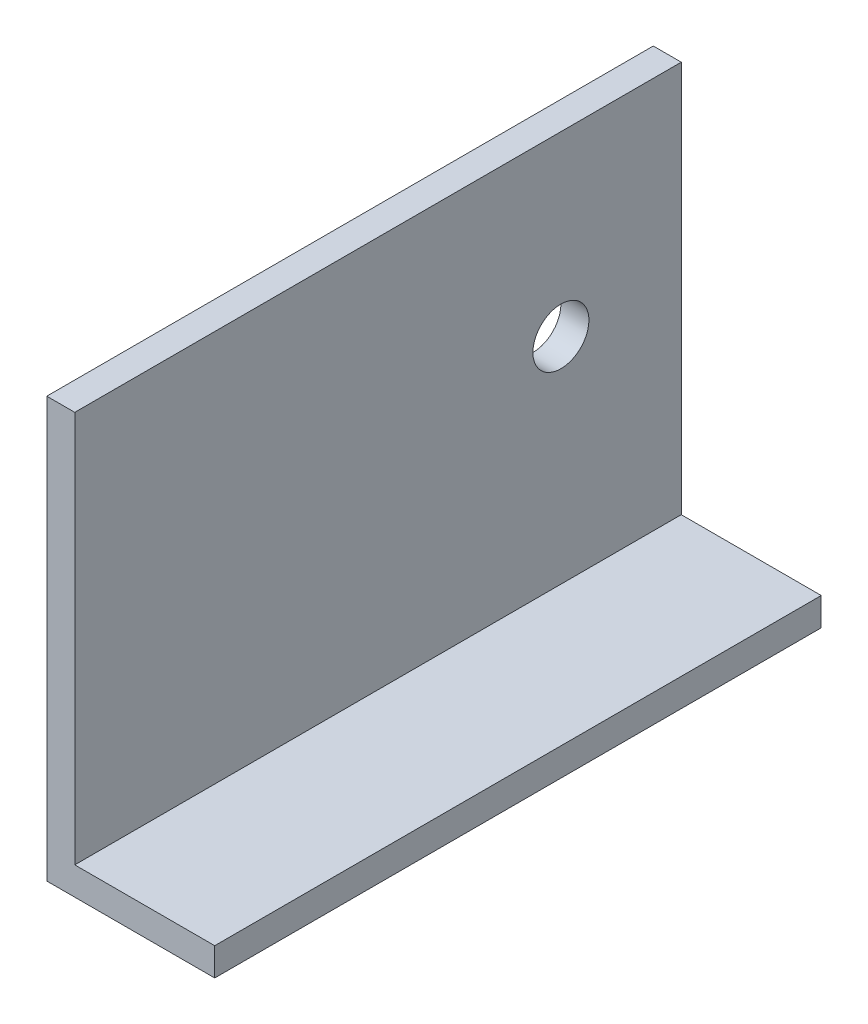
ISO-10303-21;
HEADER;
FILE_DESCRIPTION(('STEP AP214'),'2;1');
FILE_NAME('part.step','',(''),(''),'','','');
FILE_SCHEMA(('AUTOMOTIVE_DESIGN { 1 0 10303 214 1 1 1 1 }'));
ENDSEC;
DATA;
#1=APPLICATION_CONTEXT('core data for automotive mechanical design processes');
#2=APPLICATION_PROTOCOL_DEFINITION('international standard','automotive_design',2000,#1);
#3=PRODUCT_CONTEXT('',#1,'mechanical');
#4=PRODUCT('Part','Part','',(#3));
#5=PRODUCT_RELATED_PRODUCT_CATEGORY('part','',(#4));
#6=PRODUCT_DEFINITION_FORMATION('','',#4);
#7=PRODUCT_DEFINITION_CONTEXT('part definition',#1,'design');
#8=PRODUCT_DEFINITION('design','',#6,#7);
#9=PRODUCT_DEFINITION_SHAPE('','',#8);
#10=(LENGTH_UNIT() NAMED_UNIT(*) SI_UNIT(.MILLI.,.METRE.));
#11=(NAMED_UNIT(*) PLANE_ANGLE_UNIT() SI_UNIT($,.RADIAN.));
#12=(NAMED_UNIT(*) SI_UNIT($,.STERADIAN.) SOLID_ANGLE_UNIT());
#13=UNCERTAINTY_MEASURE_WITH_UNIT(LENGTH_MEASURE(1.E-05),#10,'distance_accuracy_value','');
#14=(GEOMETRIC_REPRESENTATION_CONTEXT(3) GLOBAL_UNCERTAINTY_ASSIGNED_CONTEXT((#13)) GLOBAL_UNIT_ASSIGNED_CONTEXT((#10,
#11,#12)) REPRESENTATION_CONTEXT('',''));
#15=CARTESIAN_POINT('',(0.,0.,0.));
#16=DIRECTION('',(0.,0.,1.));
#17=DIRECTION('',(1.,0.,0.));
#18=AXIS2_PLACEMENT_3D('',#15,#16,#17);
#19=CARTESIAN_POINT('',(0.,45.,65.));
#20=DIRECTION('',(1.,0.,0.));
#21=DIRECTION('',(0.,1.,0.));
#22=AXIS2_PLACEMENT_3D('',#19,#20,#21);
#23=PLANE('',#22);
#24=CARTESIAN_POINT('',(0.,26.,12.9));
#25=DIRECTION('',(1.,0.,0.));
#26=DIRECTION('',(0.,1.,0.));
#27=AXIS2_PLACEMENT_3D('',#24,#25,#26);
#28=CIRCLE('',#27,3.);
#29=CARTESIAN_POINT('',(0.,29.,12.9));
#30=VERTEX_POINT('',#29);
#31=EDGE_CURVE('E110',#30,#30,#28,.T.);
#32=ORIENTED_EDGE('',*,*,#31,.T.);
#33=EDGE_LOOP('',(#32));
#34=FACE_BOUND('',#33,.T.);
#35=DIRECTION('',(0.,-1.,0.));
#36=VECTOR('',#35,1.);
#37=CARTESIAN_POINT('',(0.,45.,0.));
#38=LINE('',#37,#36);
#39=CARTESIAN_POINT('',(0.,45.,0.));
#40=VERTEX_POINT('',#39);
#41=CARTESIAN_POINT('',(0.,0.,0.));
#42=VERTEX_POINT('',#41);
#43=EDGE_CURVE('E129',#40,#42,#38,.T.);
#44=ORIENTED_EDGE('',*,*,#43,.T.);
#45=DIRECTION('',(0.,0.,-1.));
#46=VECTOR('',#45,1.);
#47=CARTESIAN_POINT('',(0.,0.,65.));
#48=LINE('',#47,#46);
#49=CARTESIAN_POINT('',(0.,0.,65.));
#50=VERTEX_POINT('',#49);
#51=EDGE_CURVE('E126',#50,#42,#48,.T.);
#52=ORIENTED_EDGE('',*,*,#51,.F.);
#53=DIRECTION('',(0.,-1.,0.));
#54=VECTOR('',#53,1.);
#55=CARTESIAN_POINT('',(0.,45.,65.));
#56=LINE('',#55,#54);
#57=CARTESIAN_POINT('',(0.,45.,65.));
#58=VERTEX_POINT('',#57);
#59=EDGE_CURVE('E128',#58,#50,#56,.T.);
#60=ORIENTED_EDGE('',*,*,#59,.F.);
#61=DIRECTION('',(0.,0.,-1.));
#62=VECTOR('',#61,1.);
#63=CARTESIAN_POINT('',(0.,45.,65.));
#64=LINE('',#63,#62);
#65=EDGE_CURVE('E123',#58,#40,#64,.T.);
#66=ORIENTED_EDGE('',*,*,#65,.T.);
#67=EDGE_LOOP('',(#44,#52,#60,#66));
#68=FACE_BOUND('',#67,.T.);
#69=ADVANCED_FACE('F59',(#34,#68),#23,.F.);
#70=CARTESIAN_POINT('',(0.,45.,65.));
#71=DIRECTION('',(0.,1.,0.));
#72=DIRECTION('',(0.,0.,1.));
#73=AXIS2_PLACEMENT_3D('',#70,#71,#72);
#74=PLANE('',#73);
#75=DIRECTION('',(1.,0.,0.));
#76=VECTOR('',#75,1.);
#77=CARTESIAN_POINT('',(0.,45.,0.));
#78=LINE('',#77,#76);
#79=CARTESIAN_POINT('',(3.,45.,0.));
#80=VERTEX_POINT('',#79);
#81=EDGE_CURVE('E133',#40,#80,#78,.T.);
#82=ORIENTED_EDGE('',*,*,#81,.F.);
#83=ORIENTED_EDGE('',*,*,#65,.F.);
#84=DIRECTION('',(1.,0.,0.));
#85=VECTOR('',#84,1.);
#86=CARTESIAN_POINT('',(0.,45.,65.));
#87=LINE('',#86,#85);
#88=CARTESIAN_POINT('',(3.,45.,65.));
#89=VERTEX_POINT('',#88);
#90=EDGE_CURVE('E139',#58,#89,#87,.T.);
#91=ORIENTED_EDGE('',*,*,#90,.T.);
#92=DIRECTION('',(0.,0.,-1.));
#93=VECTOR('',#92,1.);
#94=CARTESIAN_POINT('',(3.,45.,65.));
#95=LINE('',#94,#93);
#96=EDGE_CURVE('E69',#89,#80,#95,.T.);
#97=ORIENTED_EDGE('',*,*,#96,.T.);
#98=EDGE_LOOP('',(#82,#83,#91,#97));
#99=FACE_BOUND('',#98,.T.);
#100=ADVANCED_FACE('F172',(#99),#74,.T.);
#101=CARTESIAN_POINT('',(0.,0.,0.));
#102=DIRECTION('',(0.,0.,-1.));
#103=DIRECTION('',(-1.,0.,0.));
#104=AXIS2_PLACEMENT_3D('',#101,#102,#103);
#105=PLANE('',#104);
#106=DIRECTION('',(1.,0.,0.));
#107=VECTOR('',#106,1.);
#108=CARTESIAN_POINT('',(0.,0.,0.));
#109=LINE('',#108,#107);
#110=CARTESIAN_POINT('',(18.,0.,0.));
#111=VERTEX_POINT('',#110);
#112=EDGE_CURVE('E94',#42,#111,#109,.T.);
#113=ORIENTED_EDGE('',*,*,#112,.F.);
#114=ORIENTED_EDGE('',*,*,#43,.F.);
#115=ORIENTED_EDGE('',*,*,#81,.T.);
#116=DIRECTION('',(0.,-1.,0.));
#117=VECTOR('',#116,1.);
#118=CARTESIAN_POINT('',(3.,45.,0.));
#119=LINE('',#118,#117);
#120=CARTESIAN_POINT('',(3.,3.00000000000002,0.));
#121=VERTEX_POINT('',#120);
#122=EDGE_CURVE('E115',#80,#121,#119,.T.);
#123=ORIENTED_EDGE('',*,*,#122,.T.);
#124=DIRECTION('',(1.,0.,0.));
#125=VECTOR('',#124,1.);
#126=CARTESIAN_POINT('',(3.,3.,0.));
#127=LINE('',#126,#125);
#128=CARTESIAN_POINT('',(18.,3.,0.));
#129=VERTEX_POINT('',#128);
#130=EDGE_CURVE('E101',#121,#129,#127,.T.);
#131=ORIENTED_EDGE('',*,*,#130,.T.);
#132=DIRECTION('',(0.,-1.,0.));
#133=VECTOR('',#132,1.);
#134=CARTESIAN_POINT('',(18.,3.,0.));
#135=LINE('',#134,#133);
#136=EDGE_CURVE('E108',#129,#111,#135,.T.);
#137=ORIENTED_EDGE('',*,*,#136,.T.);
#138=EDGE_LOOP('',(#113,#114,#115,#123,#131,#137));
#139=FACE_BOUND('',#138,.T.);
#140=ADVANCED_FACE('F112',(#139),#105,.T.);
#141=CARTESIAN_POINT('',(0.,0.,65.));
#142=DIRECTION('',(0.,0.,-1.));
#143=DIRECTION('',(-1.,0.,0.));
#144=AXIS2_PLACEMENT_3D('',#141,#142,#143);
#145=PLANE('',#144);
#146=DIRECTION('',(1.,0.,0.));
#147=VECTOR('',#146,1.);
#148=CARTESIAN_POINT('',(0.,0.,65.));
#149=LINE('',#148,#147);
#150=CARTESIAN_POINT('',(18.,0.,65.));
#151=VERTEX_POINT('',#150);
#152=EDGE_CURVE('E132',#50,#151,#149,.T.);
#153=ORIENTED_EDGE('',*,*,#152,.T.);
#154=DIRECTION('',(0.,-1.,0.));
#155=VECTOR('',#154,1.);
#156=CARTESIAN_POINT('',(18.,3.,65.));
#157=LINE('',#156,#155);
#158=CARTESIAN_POINT('',(18.,3.,65.));
#159=VERTEX_POINT('',#158);
#160=EDGE_CURVE('E116',#159,#151,#157,.T.);
#161=ORIENTED_EDGE('',*,*,#160,.F.);
#162=DIRECTION('',(1.,0.,0.));
#163=VECTOR('',#162,1.);
#164=CARTESIAN_POINT('',(3.,3.,65.));
#165=LINE('',#164,#163);
#166=CARTESIAN_POINT('',(3.,3.00000000000002,65.));
#167=VERTEX_POINT('',#166);
#168=EDGE_CURVE('E103',#167,#159,#165,.T.);
#169=ORIENTED_EDGE('',*,*,#168,.F.);
#170=DIRECTION('',(0.,-1.,0.));
#171=VECTOR('',#170,1.);
#172=CARTESIAN_POINT('',(3.,45.,65.));
#173=LINE('',#172,#171);
#174=EDGE_CURVE('E142',#89,#167,#173,.T.);
#175=ORIENTED_EDGE('',*,*,#174,.F.);
#176=ORIENTED_EDGE('',*,*,#90,.F.);
#177=ORIENTED_EDGE('',*,*,#59,.T.);
#178=EDGE_LOOP('',(#153,#161,#169,#175,#176,#177));
#179=FACE_BOUND('',#178,.T.);
#180=ADVANCED_FACE('F159',(#179),#145,.F.);
#181=CARTESIAN_POINT('',(3.,45.,65.));
#182=DIRECTION('',(1.,0.,0.));
#183=DIRECTION('',(0.,1.,0.));
#184=AXIS2_PLACEMENT_3D('',#181,#182,#183);
#185=PLANE('',#184);
#186=CARTESIAN_POINT('',(3.,26.,12.9));
#187=DIRECTION('',(1.,0.,0.));
#188=DIRECTION('',(0.,1.,0.));
#189=AXIS2_PLACEMENT_3D('',#186,#187,#188);
#190=CIRCLE('',#189,3.);
#191=CARTESIAN_POINT('',(3.,29.,12.9));
#192=VERTEX_POINT('',#191);
#193=EDGE_CURVE('E148',#192,#192,#190,.T.);
#194=ORIENTED_EDGE('',*,*,#193,.F.);
#195=EDGE_LOOP('',(#194));
#196=FACE_BOUND('',#195,.T.);
#197=ORIENTED_EDGE('',*,*,#174,.T.);
#198=DIRECTION('',(0.,0.,-1.));
#199=VECTOR('',#198,1.);
#200=CARTESIAN_POINT('',(3.,3.,65.));
#201=LINE('',#200,#199);
#202=EDGE_CURVE('E12',#167,#121,#201,.T.);
#203=ORIENTED_EDGE('',*,*,#202,.T.);
#204=ORIENTED_EDGE('',*,*,#122,.F.);
#205=ORIENTED_EDGE('',*,*,#96,.F.);
#206=EDGE_LOOP('',(#197,#203,#204,#205));
#207=FACE_BOUND('',#206,.T.);
#208=ADVANCED_FACE('F155',(#196,#207),#185,.T.);
#209=CARTESIAN_POINT('',(0.,0.,65.));
#210=DIRECTION('',(0.,1.,0.));
#211=DIRECTION('',(0.,0.,1.));
#212=AXIS2_PLACEMENT_3D('',#209,#210,#211);
#213=PLANE('',#212);
#214=ORIENTED_EDGE('',*,*,#112,.T.);
#215=DIRECTION('',(0.,0.,-1.));
#216=VECTOR('',#215,1.);
#217=CARTESIAN_POINT('',(18.,0.,65.));
#218=LINE('',#217,#216);
#219=EDGE_CURVE('E63',#151,#111,#218,.T.);
#220=ORIENTED_EDGE('',*,*,#219,.F.);
#221=ORIENTED_EDGE('',*,*,#152,.F.);
#222=ORIENTED_EDGE('',*,*,#51,.T.);
#223=EDGE_LOOP('',(#214,#220,#221,#222));
#224=FACE_BOUND('',#223,.T.);
#225=ADVANCED_FACE('F158',(#224),#213,.F.);
#226=CARTESIAN_POINT('',(18.,3.,65.));
#227=DIRECTION('',(1.,0.,0.));
#228=DIRECTION('',(0.,1.,0.));
#229=AXIS2_PLACEMENT_3D('',#226,#227,#228);
#230=PLANE('',#229);
#231=ORIENTED_EDGE('',*,*,#136,.F.);
#232=DIRECTION('',(0.,0.,-1.));
#233=VECTOR('',#232,1.);
#234=CARTESIAN_POINT('',(18.,3.,65.));
#235=LINE('',#234,#233);
#236=EDGE_CURVE('E97',#159,#129,#235,.T.);
#237=ORIENTED_EDGE('',*,*,#236,.F.);
#238=ORIENTED_EDGE('',*,*,#160,.T.);
#239=ORIENTED_EDGE('',*,*,#219,.T.);
#240=EDGE_LOOP('',(#231,#237,#238,#239));
#241=FACE_BOUND('',#240,.T.);
#242=ADVANCED_FACE('F61',(#241),#230,.T.);
#243=CARTESIAN_POINT('',(3.,3.,65.));
#244=DIRECTION('',(0.,1.,0.));
#245=DIRECTION('',(0.,0.,1.));
#246=AXIS2_PLACEMENT_3D('',#243,#244,#245);
#247=PLANE('',#246);
#248=ORIENTED_EDGE('',*,*,#130,.F.);
#249=ORIENTED_EDGE('',*,*,#202,.F.);
#250=ORIENTED_EDGE('',*,*,#168,.T.);
#251=ORIENTED_EDGE('',*,*,#236,.T.);
#252=EDGE_LOOP('',(#248,#249,#250,#251));
#253=FACE_BOUND('',#252,.T.);
#254=ADVANCED_FACE('F99',(#253),#247,.T.);
#255=CARTESIAN_POINT('',(-61.5,26.,12.9));
#256=DIRECTION('',(1.,0.,0.));
#257=DIRECTION('',(0.,1.,0.));
#258=AXIS2_PLACEMENT_3D('',#255,#256,#257);
#259=CYLINDRICAL_SURFACE('',#258,3.);
#260=ORIENTED_EDGE('',*,*,#193,.T.);
#261=EDGE_LOOP('',(#260));
#262=FACE_BOUND('',#261,.T.);
#263=ORIENTED_EDGE('',*,*,#31,.F.);
#264=EDGE_LOOP('',(#263));
#265=FACE_BOUND('',#264,.T.);
#266=ADVANCED_FACE('F152',(#262,#265),#259,.F.);
#267=CLOSED_SHELL('',(#69,#100,#140,#180,#208,#225,#242,#254,#266));
#268=MANIFOLD_SOLID_BREP('B2',#267);
#269=ADVANCED_BREP_SHAPE_REPRESENTATION('',(#18,#268),#14);
#270=SHAPE_DEFINITION_REPRESENTATION(#9,#269);
ENDSEC;
END-ISO-10303-21;
